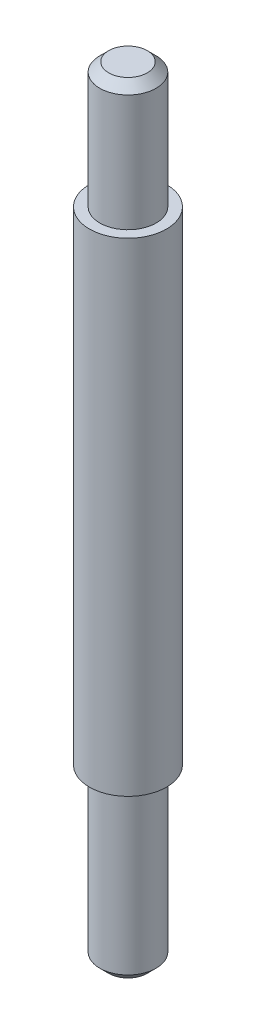
ISO-10303-21;
HEADER;
FILE_DESCRIPTION(('STEP AP214'),'2;1');
FILE_NAME('part.step','',(''),(''),'','','');
FILE_SCHEMA(('AUTOMOTIVE_DESIGN { 1 0 10303 214 1 1 1 1 }'));
ENDSEC;
DATA;
#1=APPLICATION_CONTEXT('core data for automotive mechanical design processes');
#2=APPLICATION_PROTOCOL_DEFINITION('international standard','automotive_design',2000,#1);
#3=PRODUCT_CONTEXT('',#1,'mechanical');
#4=PRODUCT('Part','Part','',(#3));
#5=PRODUCT_RELATED_PRODUCT_CATEGORY('part','',(#4));
#6=PRODUCT_DEFINITION_FORMATION('','',#4);
#7=PRODUCT_DEFINITION_CONTEXT('part definition',#1,'design');
#8=PRODUCT_DEFINITION('design','',#6,#7);
#9=PRODUCT_DEFINITION_SHAPE('','',#8);
#10=(LENGTH_UNIT() NAMED_UNIT(*) SI_UNIT(.MILLI.,.METRE.));
#11=(NAMED_UNIT(*) PLANE_ANGLE_UNIT() SI_UNIT($,.RADIAN.));
#12=(NAMED_UNIT(*) SI_UNIT($,.STERADIAN.) SOLID_ANGLE_UNIT());
#13=UNCERTAINTY_MEASURE_WITH_UNIT(LENGTH_MEASURE(1.E-05),#10,'distance_accuracy_value','');
#14=(GEOMETRIC_REPRESENTATION_CONTEXT(3) GLOBAL_UNCERTAINTY_ASSIGNED_CONTEXT((#13)) GLOBAL_UNIT_ASSIGNED_CONTEXT((#10,
#11,#12)) REPRESENTATION_CONTEXT('',''));
#15=CARTESIAN_POINT('',(0.,0.,0.));
#16=DIRECTION('',(0.,0.,1.));
#17=DIRECTION('',(1.,0.,0.));
#18=AXIS2_PLACEMENT_3D('',#15,#16,#17);
#19=CARTESIAN_POINT('',(0.,1.40003943217666,0.));
#20=DIRECTION('',(0.,1.,0.));
#21=DIRECTION('',(0.,0.,1.));
#22=AXIS2_PLACEMENT_3D('',#19,#20,#21);
#23=PLANE('',#22);
#24=CARTESIAN_POINT('',(0.,1.40003943217666,0.));
#25=DIRECTION('',(0.,1.,0.));
#26=DIRECTION('',(0.,0.,1.));
#27=AXIS2_PLACEMENT_3D('',#24,#25,#26);
#28=CIRCLE('',#27,0.065);
#29=CARTESIAN_POINT('',(0.,1.40003943217666,0.065));
#30=VERTEX_POINT('',#29);
#31=EDGE_CURVE('E10',#30,#30,#28,.T.);
#32=ORIENTED_EDGE('',*,*,#31,.T.);
#33=EDGE_LOOP('',(#32));
#34=FACE_BOUND('',#33,.T.);
#35=ADVANCED_FACE('F35',(#34),#23,.T.);
#36=CARTESIAN_POINT('',(0.,1.40003943217666,0.));
#37=DIRECTION('',(0.,-1.,0.));
#38=DIRECTION('',(0.,0.,-1.));
#39=AXIS2_PLACEMENT_3D('',#36,#37,#38);
#40=CONICAL_SURFACE('',#39,0.065,0.785398163397447);
#41=CARTESIAN_POINT('',(0.,1.37003943217666,0.));
#42=DIRECTION('',(0.,1.,0.));
#43=DIRECTION('',(0.,0.,1.));
#44=AXIS2_PLACEMENT_3D('',#41,#42,#43);
#45=CIRCLE('',#44,0.095);
#46=CARTESIAN_POINT('',(0.,1.37003943217666,0.095));
#47=VERTEX_POINT('',#46);
#48=EDGE_CURVE('E41',#47,#47,#45,.T.);
#49=ORIENTED_EDGE('',*,*,#48,.T.);
#50=EDGE_LOOP('',(#49));
#51=FACE_BOUND('',#50,.T.);
#52=ORIENTED_EDGE('',*,*,#31,.F.);
#53=EDGE_LOOP('',(#52));
#54=FACE_BOUND('',#53,.T.);
#55=ADVANCED_FACE('F79',(#51,#54),#40,.T.);
#56=CARTESIAN_POINT('',(0.,1.40003943217666,0.));
#57=DIRECTION('',(0.,1.,0.));
#58=DIRECTION('',(0.,0.,1.));
#59=AXIS2_PLACEMENT_3D('',#56,#57,#58);
#60=CYLINDRICAL_SURFACE('',#59,0.095);
#61=CARTESIAN_POINT('',(0.,0.976440753720984,0.));
#62=DIRECTION('',(0.,1.,0.));
#63=DIRECTION('',(0.,0.,1.));
#64=AXIS2_PLACEMENT_3D('',#61,#62,#63);
#65=CIRCLE('',#64,0.0949999999999999);
#66=CARTESIAN_POINT('',(0.,0.976440753720984,0.0949999999999999));
#67=VERTEX_POINT('',#66);
#68=EDGE_CURVE('E45',#67,#67,#65,.T.);
#69=ORIENTED_EDGE('',*,*,#68,.T.);
#70=EDGE_LOOP('',(#69));
#71=FACE_BOUND('',#70,.T.);
#72=ORIENTED_EDGE('',*,*,#48,.F.);
#73=EDGE_LOOP('',(#72));
#74=FACE_BOUND('',#73,.T.);
#75=ADVANCED_FACE('F83',(#71,#74),#60,.T.);
#76=CARTESIAN_POINT('',(0.,0.976440753720984,0.0949999999999999));
#77=DIRECTION('',(0.,1.,0.));
#78=DIRECTION('',(0.,0.,1.));
#79=AXIS2_PLACEMENT_3D('',#76,#77,#78);
#80=PLANE('',#79);
#81=CARTESIAN_POINT('',(0.,0.976440753720984,0.));
#82=DIRECTION('',(0.,1.,0.));
#83=DIRECTION('',(0.,0.,1.));
#84=AXIS2_PLACEMENT_3D('',#81,#82,#83);
#85=CIRCLE('',#84,0.13);
#86=CARTESIAN_POINT('',(0.,0.976440753720984,0.13));
#87=VERTEX_POINT('',#86);
#88=EDGE_CURVE('E49',#87,#87,#85,.T.);
#89=ORIENTED_EDGE('',*,*,#88,.T.);
#90=EDGE_LOOP('',(#89));
#91=FACE_BOUND('',#90,.T.);
#92=ORIENTED_EDGE('',*,*,#68,.F.);
#93=EDGE_LOOP('',(#92));
#94=FACE_BOUND('',#93,.T.);
#95=ADVANCED_FACE('F87',(#91,#94),#80,.T.);
#96=CARTESIAN_POINT('',(0.,1.40003943217666,0.));
#97=DIRECTION('',(0.,1.,0.));
#98=DIRECTION('',(0.,0.,1.));
#99=AXIS2_PLACEMENT_3D('',#96,#97,#98);
#100=CYLINDRICAL_SURFACE('',#99,0.13);
#101=CARTESIAN_POINT('',(0.,-0.653559246279016,0.));
#102=DIRECTION('',(0.,1.,0.));
#103=DIRECTION('',(0.,0.,1.));
#104=AXIS2_PLACEMENT_3D('',#101,#102,#103);
#105=CIRCLE('',#104,0.13);
#106=CARTESIAN_POINT('',(0.,-0.653559246279016,0.13));
#107=VERTEX_POINT('',#106);
#108=EDGE_CURVE('E54',#107,#107,#105,.T.);
#109=ORIENTED_EDGE('',*,*,#108,.T.);
#110=EDGE_LOOP('',(#109));
#111=FACE_BOUND('',#110,.T.);
#112=ORIENTED_EDGE('',*,*,#88,.F.);
#113=EDGE_LOOP('',(#112));
#114=FACE_BOUND('',#113,.T.);
#115=ADVANCED_FACE('F94',(#111,#114),#100,.T.);
#116=CARTESIAN_POINT('',(0.,-0.653559246279016,0.13));
#117=DIRECTION('',(0.,-1.,0.));
#118=DIRECTION('',(0.,0.,-1.));
#119=AXIS2_PLACEMENT_3D('',#116,#117,#118);
#120=PLANE('',#119);
#121=CARTESIAN_POINT('',(0.,-0.653559246279016,0.));
#122=DIRECTION('',(0.,1.,0.));
#123=DIRECTION('',(0.,0.,1.));
#124=AXIS2_PLACEMENT_3D('',#121,#122,#123);
#125=CIRCLE('',#124,0.0949999999999998);
#126=CARTESIAN_POINT('',(0.,-0.653559246279016,0.0949999999999998));
#127=VERTEX_POINT('',#126);
#128=EDGE_CURVE('E57',#127,#127,#125,.T.);
#129=ORIENTED_EDGE('',*,*,#128,.T.);
#130=EDGE_LOOP('',(#129));
#131=FACE_BOUND('',#130,.T.);
#132=ORIENTED_EDGE('',*,*,#108,.F.);
#133=EDGE_LOOP('',(#132));
#134=FACE_BOUND('',#133,.T.);
#135=ADVANCED_FACE('F98',(#131,#134),#120,.T.);
#136=CARTESIAN_POINT('',(0.,1.40003943217666,0.));
#137=DIRECTION('',(0.,1.,0.));
#138=DIRECTION('',(0.,0.,1.));
#139=AXIS2_PLACEMENT_3D('',#136,#137,#138);
#140=CYLINDRICAL_SURFACE('',#139,0.0949999999999997);
#141=CARTESIAN_POINT('',(0.,-1.19996056782334,0.));
#142=DIRECTION('',(0.,1.,0.));
#143=DIRECTION('',(0.,0.,1.));
#144=AXIS2_PLACEMENT_3D('',#141,#142,#143);
#145=CIRCLE('',#144,0.0949999999999997);
#146=CARTESIAN_POINT('',(0.,-1.19996056782334,0.0949999999999997));
#147=VERTEX_POINT('',#146);
#148=EDGE_CURVE('E60',#147,#147,#145,.T.);
#149=ORIENTED_EDGE('',*,*,#148,.T.);
#150=EDGE_LOOP('',(#149));
#151=FACE_BOUND('',#150,.T.);
#152=ORIENTED_EDGE('',*,*,#128,.F.);
#153=EDGE_LOOP('',(#152));
#154=FACE_BOUND('',#153,.T.);
#155=ADVANCED_FACE('F76',(#151,#154),#140,.T.);
#156=CARTESIAN_POINT('',(0.,-1.19996056782334,0.));
#157=DIRECTION('',(0.,1.,0.));
#158=DIRECTION('',(0.,0.,1.));
#159=AXIS2_PLACEMENT_3D('',#156,#157,#158);
#160=CONICAL_SURFACE('',#159,0.0949999999999997,0.785398163397447);
#161=CARTESIAN_POINT('',(0.,-1.22996056782334,0.));
#162=DIRECTION('',(0.,1.,0.));
#163=DIRECTION('',(0.,0.,1.));
#164=AXIS2_PLACEMENT_3D('',#161,#162,#163);
#165=CIRCLE('',#164,0.0649999999999997);
#166=CARTESIAN_POINT('',(0.,-1.22996056782334,0.0649999999999997));
#167=VERTEX_POINT('',#166);
#168=EDGE_CURVE('E63',#167,#167,#165,.T.);
#169=ORIENTED_EDGE('',*,*,#168,.T.);
#170=EDGE_LOOP('',(#169));
#171=FACE_BOUND('',#170,.T.);
#172=ORIENTED_EDGE('',*,*,#148,.F.);
#173=EDGE_LOOP('',(#172));
#174=FACE_BOUND('',#173,.T.);
#175=ADVANCED_FACE('F67',(#171,#174),#160,.T.);
#176=CARTESIAN_POINT('',(0.,-1.22996056782334,0.0649999999999997));
#177=DIRECTION('',(0.,-1.,0.));
#178=DIRECTION('',(0.,0.,-1.));
#179=AXIS2_PLACEMENT_3D('',#176,#177,#178);
#180=PLANE('',#179);
#181=ORIENTED_EDGE('',*,*,#168,.F.);
#182=EDGE_LOOP('',(#181));
#183=FACE_BOUND('',#182,.T.);
#184=ADVANCED_FACE('F70',(#183),#180,.T.);
#185=CLOSED_SHELL('',(#35,#55,#75,#95,#115,#135,#155,#175,#184));
#186=MANIFOLD_SOLID_BREP('B2',#185);
#187=ADVANCED_BREP_SHAPE_REPRESENTATION('',(#18,#186),#14);
#188=SHAPE_DEFINITION_REPRESENTATION(#9,#187);
ENDSEC;
END-ISO-10303-21;
